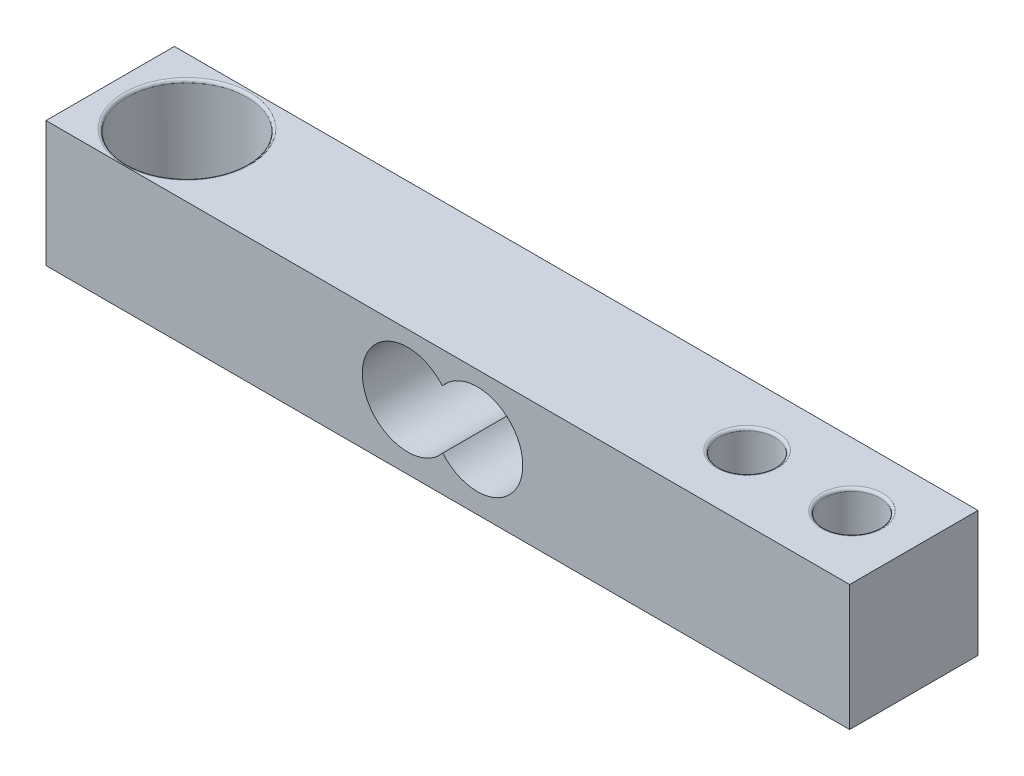
ISO-10303-21;
HEADER;
FILE_DESCRIPTION(('STEP AP214'),'2;1');
FILE_NAME('part.step','',(''),(''),'','','');
FILE_SCHEMA(('AUTOMOTIVE_DESIGN { 1 0 10303 214 1 1 1 1 }'));
ENDSEC;
DATA;
#1=APPLICATION_CONTEXT('core data for automotive mechanical design processes');
#2=APPLICATION_PROTOCOL_DEFINITION('international standard','automotive_design',2000,#1);
#3=PRODUCT_CONTEXT('',#1,'mechanical');
#4=PRODUCT('Part','Part','',(#3));
#5=PRODUCT_RELATED_PRODUCT_CATEGORY('part','',(#4));
#6=PRODUCT_DEFINITION_FORMATION('','',#4);
#7=PRODUCT_DEFINITION_CONTEXT('part definition',#1,'design');
#8=PRODUCT_DEFINITION('design','',#6,#7);
#9=PRODUCT_DEFINITION_SHAPE('','',#8);
#10=(LENGTH_UNIT() NAMED_UNIT(*) SI_UNIT(.MILLI.,.METRE.));
#11=(NAMED_UNIT(*) PLANE_ANGLE_UNIT() SI_UNIT($,.RADIAN.));
#12=(NAMED_UNIT(*) SI_UNIT($,.STERADIAN.) SOLID_ANGLE_UNIT());
#13=UNCERTAINTY_MEASURE_WITH_UNIT(LENGTH_MEASURE(1.E-05),#10,'distance_accuracy_value','');
#14=(GEOMETRIC_REPRESENTATION_CONTEXT(3) GLOBAL_UNCERTAINTY_ASSIGNED_CONTEXT((#13)) GLOBAL_UNIT_ASSIGNED_CONTEXT((#10,
#11,#12)) REPRESENTATION_CONTEXT('',''));
#15=CARTESIAN_POINT('',(0.,0.,0.));
#16=DIRECTION('',(0.,0.,1.));
#17=DIRECTION('',(1.,0.,0.));
#18=AXIS2_PLACEMENT_3D('',#15,#16,#17);
#19=CARTESIAN_POINT('',(0.,9.,0.));
#20=DIRECTION('',(1.,0.,0.));
#21=DIRECTION('',(0.,0.,-1.));
#22=AXIS2_PLACEMENT_3D('',#19,#20,#21);
#23=PLANE('',#22);
#24=DIRECTION('',(0.,0.,1.));
#25=VECTOR('',#24,1.);
#26=CARTESIAN_POINT('',(0.,0.,0.));
#27=LINE('',#26,#25);
#28=CARTESIAN_POINT('',(0.,0.,-9.19464984310385));
#29=VERTEX_POINT('',#28);
#30=CARTESIAN_POINT('',(0.,0.,0.));
#31=VERTEX_POINT('',#30);
#32=EDGE_CURVE('E127',#29,#31,#27,.T.);
#33=ORIENTED_EDGE('',*,*,#32,.T.);
#34=DIRECTION('',(0.,-1.,0.));
#35=VECTOR('',#34,1.);
#36=CARTESIAN_POINT('',(0.,9.,0.));
#37=LINE('',#36,#35);
#38=CARTESIAN_POINT('',(0.,9.,0.));
#39=VERTEX_POINT('',#38);
#40=EDGE_CURVE('E153',#39,#31,#37,.T.);
#41=ORIENTED_EDGE('',*,*,#40,.F.);
#42=DIRECTION('',(0.,0.,1.));
#43=VECTOR('',#42,1.);
#44=CARTESIAN_POINT('',(0.,9.,0.));
#45=LINE('',#44,#43);
#46=CARTESIAN_POINT('',(0.,9.,-9.19464984310385));
#47=VERTEX_POINT('',#46);
#48=EDGE_CURVE('E130',#47,#39,#45,.T.);
#49=ORIENTED_EDGE('',*,*,#48,.F.);
#50=DIRECTION('',(0.,-1.,0.));
#51=VECTOR('',#50,1.);
#52=CARTESIAN_POINT('',(0.,9.,-9.19464984310385));
#53=LINE('',#52,#51);
#54=EDGE_CURVE('E140',#47,#29,#53,.T.);
#55=ORIENTED_EDGE('',*,*,#54,.T.);
#56=EDGE_LOOP('',(#33,#41,#49,#55));
#57=FACE_BOUND('',#56,.T.);
#58=ADVANCED_FACE('F47',(#57),#23,.F.);
#59=CARTESIAN_POINT('',(0.,9.,0.));
#60=DIRECTION('',(0.,0.,-1.));
#61=DIRECTION('',(-1.,0.,0.));
#62=AXIS2_PLACEMENT_3D('',#59,#60,#61);
#63=PLANE('',#62);
#64=CARTESIAN_POINT('',(25.9056893792605,4.63988150086459,0.));
#65=DIRECTION('',(0.,0.,1.));
#66=DIRECTION('',(1.,0.,0.));
#67=AXIS2_PLACEMENT_3D('',#64,#65,#66);
#68=CIRCLE('',#67,3.25);
#69=CARTESIAN_POINT('',(28.3869410176541,6.73890277445112,0.));
#70=VERTEX_POINT('',#69);
#71=CARTESIAN_POINT('',(28.4202056288866,2.58082637038218,0.));
#72=VERTEX_POINT('',#71);
#73=EDGE_CURVE('E114',#70,#72,#68,.T.);
#74=ORIENTED_EDGE('',*,*,#73,.F.);
#75=CARTESIAN_POINT('',(30.9014572672803,4.67984764396871,0.));
#76=DIRECTION('',(0.,0.,1.));
#77=DIRECTION('',(1.,0.,0.));
#78=AXIS2_PLACEMENT_3D('',#75,#76,#77);
#79=CIRCLE('',#78,3.25);
#80=EDGE_CURVE('E61',#72,#70,#79,.T.);
#81=ORIENTED_EDGE('',*,*,#80,.F.);
#82=EDGE_LOOP('',(#74,#81));
#83=FACE_BOUND('',#82,.T.);
#84=DIRECTION('',(1.,0.,0.));
#85=VECTOR('',#84,1.);
#86=CARTESIAN_POINT('',(0.,0.,0.));
#87=LINE('',#86,#85);
#88=CARTESIAN_POINT('',(57.5665033655198,0.,0.));
#89=VERTEX_POINT('',#88);
#90=EDGE_CURVE('E136',#31,#89,#87,.T.);
#91=ORIENTED_EDGE('',*,*,#90,.T.);
#92=DIRECTION('',(0.,-1.,0.));
#93=VECTOR('',#92,1.);
#94=CARTESIAN_POINT('',(57.5665033655198,9.,0.));
#95=LINE('',#94,#93);
#96=CARTESIAN_POINT('',(57.5665033655198,9.,0.));
#97=VERTEX_POINT('',#96);
#98=EDGE_CURVE('E147',#97,#89,#95,.T.);
#99=ORIENTED_EDGE('',*,*,#98,.F.);
#100=DIRECTION('',(1.,0.,0.));
#101=VECTOR('',#100,1.);
#102=CARTESIAN_POINT('',(0.,9.,0.));
#103=LINE('',#102,#101);
#104=EDGE_CURVE('E128',#39,#97,#103,.T.);
#105=ORIENTED_EDGE('',*,*,#104,.F.);
#106=ORIENTED_EDGE('',*,*,#40,.T.);
#107=EDGE_LOOP('',(#91,#99,#105,#106));
#108=FACE_BOUND('',#107,.T.);
#109=ADVANCED_FACE('F187',(#83,#108),#63,.F.);
#110=CARTESIAN_POINT('',(57.5665033655198,9.,0.));
#111=DIRECTION('',(-1.,0.,0.));
#112=DIRECTION('',(0.,0.,1.));
#113=AXIS2_PLACEMENT_3D('',#110,#111,#112);
#114=PLANE('',#113);
#115=DIRECTION('',(0.,0.,-1.));
#116=VECTOR('',#115,1.);
#117=CARTESIAN_POINT('',(57.5665033655198,0.,0.));
#118=LINE('',#117,#116);
#119=CARTESIAN_POINT('',(57.5665033655198,0.,-9.19464984310385));
#120=VERTEX_POINT('',#119);
#121=EDGE_CURVE('E142',#89,#120,#118,.T.);
#122=ORIENTED_EDGE('',*,*,#121,.T.);
#123=DIRECTION('',(0.,-1.,0.));
#124=VECTOR('',#123,1.);
#125=CARTESIAN_POINT('',(57.5665033655198,9.,-9.19464984310385));
#126=LINE('',#125,#124);
#127=CARTESIAN_POINT('',(57.5665033655198,9.,-9.19464984310385));
#128=VERTEX_POINT('',#127);
#129=EDGE_CURVE('E150',#128,#120,#126,.T.);
#130=ORIENTED_EDGE('',*,*,#129,.F.);
#131=DIRECTION('',(0.,0.,-1.));
#132=VECTOR('',#131,1.);
#133=CARTESIAN_POINT('',(57.5665033655198,9.,0.));
#134=LINE('',#133,#132);
#135=EDGE_CURVE('E135',#97,#128,#134,.T.);
#136=ORIENTED_EDGE('',*,*,#135,.F.);
#137=ORIENTED_EDGE('',*,*,#98,.T.);
#138=EDGE_LOOP('',(#122,#130,#136,#137));
#139=FACE_BOUND('',#138,.T.);
#140=ADVANCED_FACE('F193',(#139),#114,.F.);
#141=CARTESIAN_POINT('',(0.,9.,-9.19464984310385));
#142=DIRECTION('',(0.,0.,1.));
#143=DIRECTION('',(1.,0.,0.));
#144=AXIS2_PLACEMENT_3D('',#141,#142,#143);
#145=PLANE('',#144);
#146=CARTESIAN_POINT('',(25.9056893792605,4.63988150086459,-9.19464984310385));
#147=DIRECTION('',(0.,0.,1.));
#148=DIRECTION('',(1.,0.,0.));
#149=AXIS2_PLACEMENT_3D('',#146,#147,#148);
#150=CIRCLE('',#149,3.25);
#151=CARTESIAN_POINT('',(28.3869410176541,6.73890277445112,-9.19464984310385));
#152=VERTEX_POINT('',#151);
#153=CARTESIAN_POINT('',(28.4202056288866,2.58082637038218,-9.19464984310385));
#154=VERTEX_POINT('',#153);
#155=EDGE_CURVE('E104',#152,#154,#150,.T.);
#156=ORIENTED_EDGE('',*,*,#155,.T.);
#157=CARTESIAN_POINT('',(30.9014572672803,4.67984764396871,-9.19464984310385));
#158=DIRECTION('',(0.,0.,1.));
#159=DIRECTION('',(1.,0.,0.));
#160=AXIS2_PLACEMENT_3D('',#157,#158,#159);
#161=CIRCLE('',#160,3.25);
#162=EDGE_CURVE('E69',#154,#152,#161,.T.);
#163=ORIENTED_EDGE('',*,*,#162,.T.);
#164=EDGE_LOOP('',(#156,#163));
#165=FACE_BOUND('',#164,.T.);
#166=DIRECTION('',(-1.,0.,0.));
#167=VECTOR('',#166,1.);
#168=CARTESIAN_POINT('',(0.,0.,-9.19464984310385));
#169=LINE('',#168,#167);
#170=EDGE_CURVE('E132',#120,#29,#169,.T.);
#171=ORIENTED_EDGE('',*,*,#170,.T.);
#172=ORIENTED_EDGE('',*,*,#54,.F.);
#173=DIRECTION('',(-1.,0.,0.));
#174=VECTOR('',#173,1.);
#175=CARTESIAN_POINT('',(0.,9.,-9.19464984310385));
#176=LINE('',#175,#174);
#177=EDGE_CURVE('E133',#128,#47,#176,.T.);
#178=ORIENTED_EDGE('',*,*,#177,.F.);
#179=ORIENTED_EDGE('',*,*,#129,.T.);
#180=EDGE_LOOP('',(#171,#172,#178,#179));
#181=FACE_BOUND('',#180,.T.);
#182=ADVANCED_FACE('F112',(#165,#181),#145,.F.);
#183=CARTESIAN_POINT('',(0.,9.,0.));
#184=DIRECTION('',(0.,-1.,0.));
#185=DIRECTION('',(0.,0.,-1.));
#186=AXIS2_PLACEMENT_3D('',#183,#184,#185);
#187=PLANE('',#186);
#188=CARTESIAN_POINT('',(53.0826666900883,9.,-4.64891542901818));
#189=DIRECTION('',(0.,-1.,0.));
#190=DIRECTION('',(0.,0.,-1.));
#191=AXIS2_PLACEMENT_3D('',#188,#189,#190);
#192=CIRCLE('',#191,2.19550756410314);
#193=CARTESIAN_POINT('',(53.0826666900883,9.,-6.84442299312132));
#194=VERTEX_POINT('',#193);
#195=EDGE_CURVE('E164',#194,#194,#192,.T.);
#196=ORIENTED_EDGE('',*,*,#195,.T.);
#197=EDGE_LOOP('',(#196));
#198=FACE_BOUND('',#197,.T.);
#199=CARTESIAN_POINT('',(45.5690317865065,9.,-4.64891542901821));
#200=DIRECTION('',(0.,-1.,0.));
#201=DIRECTION('',(0.,0.,-1.));
#202=AXIS2_PLACEMENT_3D('',#199,#200,#201);
#203=CIRCLE('',#202,2.19550756410314);
#204=CARTESIAN_POINT('',(45.5690317865065,9.,-6.84442299312135));
#205=VERTEX_POINT('',#204);
#206=EDGE_CURVE('E165',#205,#205,#203,.T.);
#207=ORIENTED_EDGE('',*,*,#206,.T.);
#208=EDGE_LOOP('',(#207));
#209=FACE_BOUND('',#208,.T.);
#210=CARTESIAN_POINT('',(5.56292253924379,9.,-4.53737570689572));
#211=DIRECTION('',(0.,-1.,0.));
#212=DIRECTION('',(0.,0.,-1.));
#213=AXIS2_PLACEMENT_3D('',#210,#211,#212);
#214=CIRCLE('',#213,4.5046708805913);
#215=CARTESIAN_POINT('',(5.56292253924379,9.,-9.04204658748702));
#216=VERTEX_POINT('',#215);
#217=EDGE_CURVE('E157',#216,#216,#214,.T.);
#218=ORIENTED_EDGE('',*,*,#217,.T.);
#219=EDGE_LOOP('',(#218));
#220=FACE_BOUND('',#219,.T.);
#221=ORIENTED_EDGE('',*,*,#48,.T.);
#222=ORIENTED_EDGE('',*,*,#104,.T.);
#223=ORIENTED_EDGE('',*,*,#135,.T.);
#224=ORIENTED_EDGE('',*,*,#177,.T.);
#225=EDGE_LOOP('',(#221,#222,#223,#224));
#226=FACE_BOUND('',#225,.T.);
#227=ADVANCED_FACE('F203',(#198,#209,#220,#226),#187,.F.);
#228=CARTESIAN_POINT('',(0.,0.,0.));
#229=DIRECTION('',(0.,-1.,0.));
#230=DIRECTION('',(0.,0.,-1.));
#231=AXIS2_PLACEMENT_3D('',#228,#229,#230);
#232=PLANE('',#231);
#233=CARTESIAN_POINT('',(45.5690317865065,0.,-4.64891542901821));
#234=DIRECTION('',(0.,1.,0.));
#235=DIRECTION('',(0.,0.,1.));
#236=AXIS2_PLACEMENT_3D('',#233,#234,#235);
#237=CIRCLE('',#236,1.99550756410314);
#238=CARTESIAN_POINT('',(45.5690317865065,0.,-2.65340786491507));
#239=VERTEX_POINT('',#238);
#240=EDGE_CURVE('E118',#239,#239,#237,.T.);
#241=ORIENTED_EDGE('',*,*,#240,.T.);
#242=EDGE_LOOP('',(#241));
#243=FACE_BOUND('',#242,.T.);
#244=CARTESIAN_POINT('',(53.0826666900883,0.,-4.64891542901818));
#245=DIRECTION('',(0.,1.,0.));
#246=DIRECTION('',(0.,0.,1.));
#247=AXIS2_PLACEMENT_3D('',#244,#245,#246);
#248=CIRCLE('',#247,1.99550756410314);
#249=CARTESIAN_POINT('',(53.0826666900883,0.,-2.65340786491504));
#250=VERTEX_POINT('',#249);
#251=EDGE_CURVE('E119',#250,#250,#248,.T.);
#252=ORIENTED_EDGE('',*,*,#251,.T.);
#253=EDGE_LOOP('',(#252));
#254=FACE_BOUND('',#253,.T.);
#255=CARTESIAN_POINT('',(5.56292253924379,0.,-4.53737570689572));
#256=DIRECTION('',(0.,1.,0.));
#257=DIRECTION('',(0.,0.,1.));
#258=AXIS2_PLACEMENT_3D('',#255,#256,#257);
#259=CIRCLE('',#258,4.3046708805913);
#260=CARTESIAN_POINT('',(5.56292253924379,0.,-0.232704826304417));
#261=VERTEX_POINT('',#260);
#262=EDGE_CURVE('E125',#261,#261,#259,.T.);
#263=ORIENTED_EDGE('',*,*,#262,.T.);
#264=EDGE_LOOP('',(#263));
#265=FACE_BOUND('',#264,.T.);
#266=ORIENTED_EDGE('',*,*,#32,.F.);
#267=ORIENTED_EDGE('',*,*,#170,.F.);
#268=ORIENTED_EDGE('',*,*,#121,.F.);
#269=ORIENTED_EDGE('',*,*,#90,.F.);
#270=EDGE_LOOP('',(#266,#267,#268,#269));
#271=FACE_BOUND('',#270,.T.);
#272=ADVANCED_FACE('F205',(#243,#254,#265,#271),#232,.T.);
#273=CARTESIAN_POINT('',(5.56292253924379,0.,-4.53737570689572));
#274=DIRECTION('',(0.,1.,0.));
#275=DIRECTION('',(0.,0.,1.));
#276=AXIS2_PLACEMENT_3D('',#273,#274,#275);
#277=CYLINDRICAL_SURFACE('',#276,4.3046708805913);
#278=CARTESIAN_POINT('',(5.56292253924379,8.8,-4.53737570689572));
#279=DIRECTION('',(0.,-1.,0.));
#280=DIRECTION('',(0.,0.,-1.));
#281=AXIS2_PLACEMENT_3D('',#278,#279,#280);
#282=CIRCLE('',#281,4.3046708805913);
#283=CARTESIAN_POINT('',(5.56292253924379,8.8,-8.84204658748702));
#284=VERTEX_POINT('',#283);
#285=EDGE_CURVE('E12',#284,#284,#282,.F.);
#286=ORIENTED_EDGE('',*,*,#285,.T.);
#287=EDGE_LOOP('',(#286));
#288=FACE_BOUND('',#287,.T.);
#289=ORIENTED_EDGE('',*,*,#262,.F.);
#290=EDGE_LOOP('',(#289));
#291=FACE_BOUND('',#290,.T.);
#292=ADVANCED_FACE('F202',(#288,#291),#277,.F.);
#293=CARTESIAN_POINT('',(30.9014572672803,4.67984764396871,-9.19464984310385));
#294=DIRECTION('',(0.,0.,1.));
#295=DIRECTION('',(1.,0.,0.));
#296=AXIS2_PLACEMENT_3D('',#293,#294,#295);
#297=CYLINDRICAL_SURFACE('',#296,3.25);
#298=ORIENTED_EDGE('',*,*,#80,.T.);
#299=DIRECTION('',(0.,0.,1.));
#300=VECTOR('',#299,1.);
#301=CARTESIAN_POINT('',(28.3869410176541,6.73890277445112,-9.19464984310385));
#302=LINE('',#301,#300);
#303=EDGE_CURVE('E98',#152,#70,#302,.T.);
#304=ORIENTED_EDGE('',*,*,#303,.F.);
#305=ORIENTED_EDGE('',*,*,#162,.F.);
#306=DIRECTION('',(0.,0.,1.));
#307=VECTOR('',#306,1.);
#308=CARTESIAN_POINT('',(28.4202056288866,2.58082637038218,-9.19464984310385));
#309=LINE('',#308,#307);
#310=EDGE_CURVE('E102',#154,#72,#309,.T.);
#311=ORIENTED_EDGE('',*,*,#310,.T.);
#312=EDGE_LOOP('',(#298,#304,#305,#311));
#313=FACE_BOUND('',#312,.T.);
#314=ADVANCED_FACE('F99',(#313),#297,.F.);
#315=CARTESIAN_POINT('',(25.9056893792605,4.63988150086459,-9.19464984310385));
#316=DIRECTION('',(0.,0.,1.));
#317=DIRECTION('',(1.,0.,0.));
#318=AXIS2_PLACEMENT_3D('',#315,#316,#317);
#319=CYLINDRICAL_SURFACE('',#318,3.25);
#320=ORIENTED_EDGE('',*,*,#73,.T.);
#321=ORIENTED_EDGE('',*,*,#310,.F.);
#322=ORIENTED_EDGE('',*,*,#155,.F.);
#323=ORIENTED_EDGE('',*,*,#303,.T.);
#324=EDGE_LOOP('',(#320,#321,#322,#323));
#325=FACE_BOUND('',#324,.T.);
#326=ADVANCED_FACE('F107',(#325),#319,.F.);
#327=CARTESIAN_POINT('',(53.0826666900883,0.,-4.64891542901818));
#328=DIRECTION('',(0.,1.,0.));
#329=DIRECTION('',(0.,0.,1.));
#330=AXIS2_PLACEMENT_3D('',#327,#328,#329);
#331=CYLINDRICAL_SURFACE('',#330,1.99550756410314);
#332=CARTESIAN_POINT('',(53.0826666900883,8.8,-4.64891542901818));
#333=DIRECTION('',(0.,-1.,0.));
#334=DIRECTION('',(0.,0.,-1.));
#335=AXIS2_PLACEMENT_3D('',#332,#333,#334);
#336=CIRCLE('',#335,1.99550756410314);
#337=CARTESIAN_POINT('',(53.0826666900883,8.8,-6.64442299312132));
#338=VERTEX_POINT('',#337);
#339=EDGE_CURVE('E156',#338,#338,#336,.F.);
#340=ORIENTED_EDGE('',*,*,#339,.T.);
#341=EDGE_LOOP('',(#340));
#342=FACE_BOUND('',#341,.T.);
#343=ORIENTED_EDGE('',*,*,#251,.F.);
#344=EDGE_LOOP('',(#343));
#345=FACE_BOUND('',#344,.T.);
#346=ADVANCED_FACE('F220',(#342,#345),#331,.F.);
#347=CARTESIAN_POINT('',(45.5690317865065,0.,-4.64891542901821));
#348=DIRECTION('',(0.,1.,0.));
#349=DIRECTION('',(0.,0.,1.));
#350=AXIS2_PLACEMENT_3D('',#347,#348,#349);
#351=CYLINDRICAL_SURFACE('',#350,1.99550756410314);
#352=CARTESIAN_POINT('',(45.5690317865065,8.8,-4.64891542901821));
#353=DIRECTION('',(0.,-1.,0.));
#354=DIRECTION('',(0.,0.,-1.));
#355=AXIS2_PLACEMENT_3D('',#352,#353,#354);
#356=CIRCLE('',#355,1.99550756410314);
#357=CARTESIAN_POINT('',(45.5690317865065,8.8,-6.64442299312135));
#358=VERTEX_POINT('',#357);
#359=EDGE_CURVE('E60',#358,#358,#356,.F.);
#360=ORIENTED_EDGE('',*,*,#359,.T.);
#361=EDGE_LOOP('',(#360));
#362=FACE_BOUND('',#361,.T.);
#363=ORIENTED_EDGE('',*,*,#240,.F.);
#364=EDGE_LOOP('',(#363));
#365=FACE_BOUND('',#364,.T.);
#366=ADVANCED_FACE('F168',(#362,#365),#351,.F.);
#367=CARTESIAN_POINT('',(53.0826666900883,8.8,-4.64891542901818));
#368=DIRECTION('',(0.,-1.,0.));
#369=DIRECTION('',(0.,0.,-1.));
#370=AXIS2_PLACEMENT_3D('',#367,#368,#369);
#371=TOROIDAL_SURFACE('',#370,2.19550756410314,0.2);
#372=ORIENTED_EDGE('',*,*,#195,.F.);
#373=EDGE_LOOP('',(#372));
#374=FACE_BOUND('',#373,.T.);
#375=ORIENTED_EDGE('',*,*,#339,.F.);
#376=EDGE_LOOP('',(#375));
#377=FACE_BOUND('',#376,.T.);
#378=ADVANCED_FACE('F173',(#374,#377),#371,.T.);
#379=CARTESIAN_POINT('',(45.5690317865065,8.8,-4.64891542901821));
#380=DIRECTION('',(0.,-1.,0.));
#381=DIRECTION('',(0.,0.,-1.));
#382=AXIS2_PLACEMENT_3D('',#379,#380,#381);
#383=TOROIDAL_SURFACE('',#382,2.19550756410314,0.2);
#384=ORIENTED_EDGE('',*,*,#206,.F.);
#385=EDGE_LOOP('',(#384));
#386=FACE_BOUND('',#385,.T.);
#387=ORIENTED_EDGE('',*,*,#359,.F.);
#388=EDGE_LOOP('',(#387));
#389=FACE_BOUND('',#388,.T.);
#390=ADVANCED_FACE('F175',(#386,#389),#383,.T.);
#391=CARTESIAN_POINT('',(5.56292253924379,8.8,-4.53737570689572));
#392=DIRECTION('',(0.,-1.,0.));
#393=DIRECTION('',(0.,0.,-1.));
#394=AXIS2_PLACEMENT_3D('',#391,#392,#393);
#395=TOROIDAL_SURFACE('',#394,4.5046708805913,0.2);
#396=ORIENTED_EDGE('',*,*,#217,.F.);
#397=EDGE_LOOP('',(#396));
#398=FACE_BOUND('',#397,.T.);
#399=ORIENTED_EDGE('',*,*,#285,.F.);
#400=EDGE_LOOP('',(#399));
#401=FACE_BOUND('',#400,.T.);
#402=ADVANCED_FACE('F51',(#398,#401),#395,.T.);
#403=CLOSED_SHELL('',(#58,#109,#140,#182,#227,#272,#292,#314,#326,#346,#366,#378,#390,#402));
#404=MANIFOLD_SOLID_BREP('B2',#403);
#405=ADVANCED_BREP_SHAPE_REPRESENTATION('',(#18,#404),#14);
#406=SHAPE_DEFINITION_REPRESENTATION(#9,#405);
ENDSEC;
END-ISO-10303-21;
